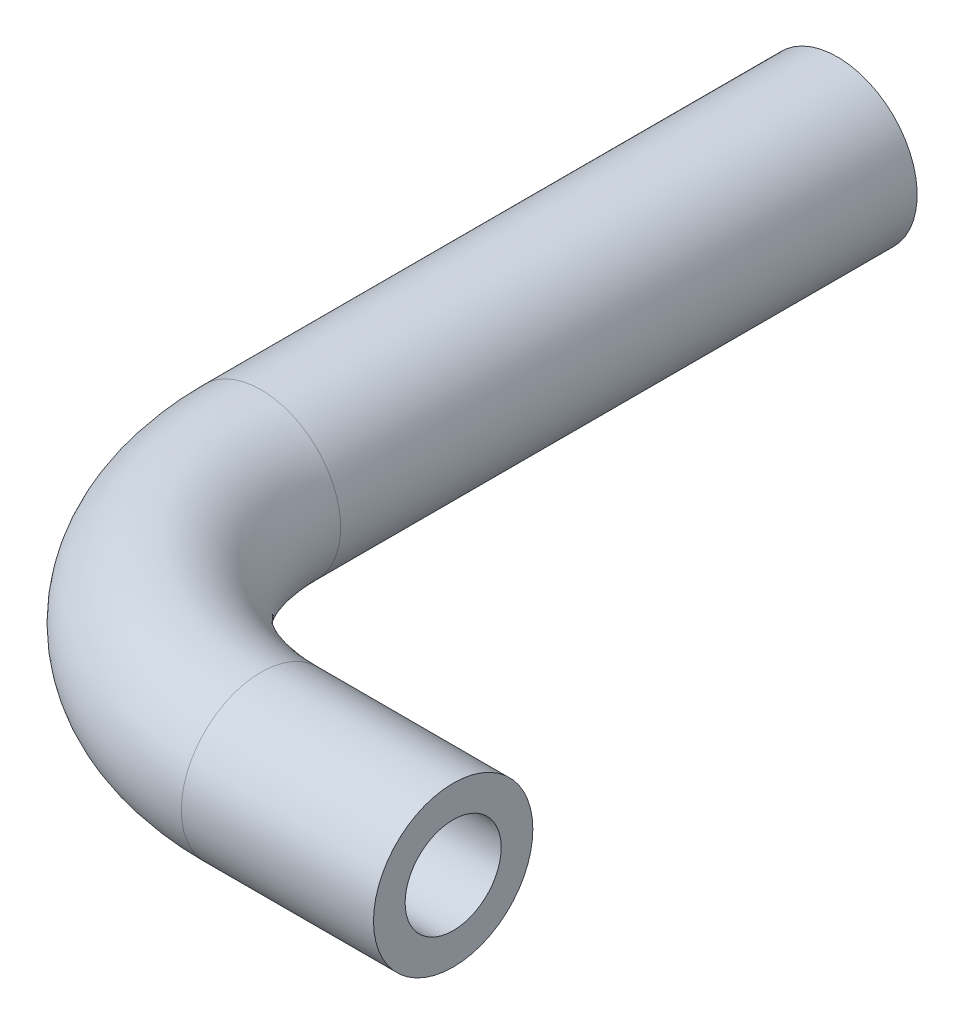
ISO-10303-21;
HEADER;
FILE_DESCRIPTION(('STEP AP214'),'2;1');
FILE_NAME('part.step','',(''),(''),'','','');
FILE_SCHEMA(('AUTOMOTIVE_DESIGN { 1 0 10303 214 1 1 1 1 }'));
ENDSEC;
DATA;
#1=APPLICATION_CONTEXT('core data for automotive mechanical design processes');
#2=APPLICATION_PROTOCOL_DEFINITION('international standard','automotive_design',2000,#1);
#3=PRODUCT_CONTEXT('',#1,'mechanical');
#4=PRODUCT('Part','Part','',(#3));
#5=PRODUCT_RELATED_PRODUCT_CATEGORY('part','',(#4));
#6=PRODUCT_DEFINITION_FORMATION('','',#4);
#7=PRODUCT_DEFINITION_CONTEXT('part definition',#1,'design');
#8=PRODUCT_DEFINITION('design','',#6,#7);
#9=PRODUCT_DEFINITION_SHAPE('','',#8);
#10=(LENGTH_UNIT() NAMED_UNIT(*) SI_UNIT(.MILLI.,.METRE.));
#11=(NAMED_UNIT(*) PLANE_ANGLE_UNIT() SI_UNIT($,.RADIAN.));
#12=(NAMED_UNIT(*) SI_UNIT($,.STERADIAN.) SOLID_ANGLE_UNIT());
#13=UNCERTAINTY_MEASURE_WITH_UNIT(LENGTH_MEASURE(1.E-05),#10,'distance_accuracy_value','');
#14=(GEOMETRIC_REPRESENTATION_CONTEXT(3) GLOBAL_UNCERTAINTY_ASSIGNED_CONTEXT((#13)) GLOBAL_UNIT_ASSIGNED_CONTEXT((#10,
#11,#12)) REPRESENTATION_CONTEXT('',''));
#15=CARTESIAN_POINT('',(0.,0.,0.));
#16=DIRECTION('',(0.,0.,1.));
#17=DIRECTION('',(1.,0.,0.));
#18=AXIS2_PLACEMENT_3D('',#15,#16,#17);
#19=CARTESIAN_POINT('',(0.,0.,-32.3402844362731));
#20=DIRECTION('',(0.,-1.,0.));
#21=DIRECTION('',(0.,0.,-1.));
#22=AXIS2_PLACEMENT_3D('',#19,#20,#21);
#23=TOROIDAL_SURFACE('',#22,32.3402844362731,10.5308858365806);
#24=CARTESIAN_POINT('',(0.,0.,0.));
#25=DIRECTION('',(1.,0.,0.));
#26=DIRECTION('',(0.,0.,-1.));
#27=AXIS2_PLACEMENT_3D('',#24,#25,#26);
#28=CIRCLE('',#27,10.5308858365806);
#29=CARTESIAN_POINT('',(0.,0.,10.5308858365806));
#30=VERTEX_POINT('',#29);
#31=EDGE_CURVE('E40',#30,#30,#28,.T.);
#32=CARTESIAN_POINT('',(-32.3402844362731,0.,-32.3402844362731));
#33=DIRECTION('',(0.,0.,-1.));
#34=DIRECTION('',(-1.,0.,0.));
#35=AXIS2_PLACEMENT_3D('',#32,#33,#34);
#36=CIRCLE('',#35,10.5308858365806);
#37=CARTESIAN_POINT('',(-42.8711702728538,0.,-32.3402844362731));
#38=VERTEX_POINT('',#37);
#39=EDGE_CURVE('E51',#38,#38,#36,.T.);
#40=CARTESIAN_POINT('',(0.,0.,-32.3402844362731));
#41=DIRECTION('',(0.,-1.,0.));
#42=DIRECTION('',(0.,0.,-1.));
#43=AXIS2_PLACEMENT_3D('',#40,#41,#42);
#44=CIRCLE('',#43,42.8711702728538);
#45=EDGE_CURVE('',#30,#38,#44,.T.);
#46=ORIENTED_EDGE('',*,*,#31,.F.);
#47=ORIENTED_EDGE('',*,*,#39,.F.);
#48=ORIENTED_EDGE('',*,*,#45,.T.);
#49=ORIENTED_EDGE('',*,*,#45,.F.);
#50=EDGE_LOOP('',(#46,#48,#47,#49));
#51=FACE_BOUND('',#50,.T.);
#52=ADVANCED_FACE('F37',(#51),#23,.T.);
#53=CARTESIAN_POINT('',(0.,0.,-32.3402844362731));
#54=DIRECTION('',(0.,-1.,0.));
#55=DIRECTION('',(0.,0.,-1.));
#56=AXIS2_PLACEMENT_3D('',#53,#54,#55);
#57=TOROIDAL_SURFACE('',#56,32.3402844362731,6.35);
#58=CARTESIAN_POINT('',(0.,0.,0.));
#59=DIRECTION('',(1.,0.,0.));
#60=DIRECTION('',(0.,0.,-1.));
#61=AXIS2_PLACEMENT_3D('',#58,#59,#60);
#62=CIRCLE('',#61,6.35);
#63=CARTESIAN_POINT('',(0.,0.,6.35));
#64=VERTEX_POINT('',#63);
#65=EDGE_CURVE('E10',#64,#64,#62,.F.);
#66=CARTESIAN_POINT('',(-32.3402844362731,0.,-32.3402844362731));
#67=DIRECTION('',(0.,0.,-1.));
#68=DIRECTION('',(-1.,0.,0.));
#69=AXIS2_PLACEMENT_3D('',#66,#67,#68);
#70=CIRCLE('',#69,6.35);
#71=CARTESIAN_POINT('',(-38.6902844362731,0.,-32.3402844362731));
#72=VERTEX_POINT('',#71);
#73=EDGE_CURVE('E59',#72,#72,#70,.T.);
#74=CARTESIAN_POINT('',(0.,0.,-32.3402844362731));
#75=DIRECTION('',(0.,-1.,0.));
#76=DIRECTION('',(0.,0.,-1.));
#77=AXIS2_PLACEMENT_3D('',#74,#75,#76);
#78=CIRCLE('',#77,38.6902844362731);
#79=EDGE_CURVE('',#64,#72,#78,.T.);
#80=ORIENTED_EDGE('',*,*,#65,.F.);
#81=ORIENTED_EDGE('',*,*,#73,.T.);
#82=ORIENTED_EDGE('',*,*,#79,.T.);
#83=ORIENTED_EDGE('',*,*,#79,.F.);
#84=EDGE_LOOP('',(#80,#82,#81,#83));
#85=FACE_BOUND('',#84,.T.);
#86=ADVANCED_FACE('F93',(#85),#57,.F.);
#87=CARTESIAN_POINT('',(-32.3402844362731,0.,-108.540284436273));
#88=DIRECTION('',(0.,0.,-1.));
#89=DIRECTION('',(-1.,0.,0.));
#90=AXIS2_PLACEMENT_3D('',#87,#88,#89);
#91=PLANE('',#90);
#92=CARTESIAN_POINT('',(-32.3402844362731,0.,-108.540284436273));
#93=DIRECTION('',(0.,0.,-1.));
#94=DIRECTION('',(-1.,0.,0.));
#95=AXIS2_PLACEMENT_3D('',#92,#93,#94);
#96=CIRCLE('',#95,10.5308858365806);
#97=CARTESIAN_POINT('',(-42.8711702728538,0.,-108.540284436273));
#98=VERTEX_POINT('',#97);
#99=EDGE_CURVE('E49',#98,#98,#96,.T.);
#100=ORIENTED_EDGE('',*,*,#99,.T.);
#101=EDGE_LOOP('',(#100));
#102=FACE_BOUND('',#101,.T.);
#103=CARTESIAN_POINT('',(-32.3402844362731,0.,-108.540284436273));
#104=DIRECTION('',(0.,0.,-1.));
#105=DIRECTION('',(-1.,0.,0.));
#106=AXIS2_PLACEMENT_3D('',#103,#104,#105);
#107=CIRCLE('',#106,6.35);
#108=CARTESIAN_POINT('',(-38.6902844362731,0.,-108.540284436273));
#109=VERTEX_POINT('',#108);
#110=EDGE_CURVE('E55',#109,#109,#107,.T.);
#111=ORIENTED_EDGE('',*,*,#110,.F.);
#112=EDGE_LOOP('',(#111));
#113=FACE_BOUND('',#112,.T.);
#114=ADVANCED_FACE('F95',(#102,#113),#91,.T.);
#115=CARTESIAN_POINT('',(-32.3402844362731,0.,-108.540284436273));
#116=DIRECTION('',(0.,0.,1.));
#117=DIRECTION('',(1.,0.,0.));
#118=AXIS2_PLACEMENT_3D('',#115,#116,#117);
#119=CYLINDRICAL_SURFACE('',#118,10.5308858365806);
#120=ORIENTED_EDGE('',*,*,#99,.F.);
#121=EDGE_LOOP('',(#120));
#122=FACE_BOUND('',#121,.T.);
#123=ORIENTED_EDGE('',*,*,#39,.T.);
#124=EDGE_LOOP('',(#123));
#125=FACE_BOUND('',#124,.T.);
#126=ADVANCED_FACE('F89',(#122,#125),#119,.T.);
#127=CARTESIAN_POINT('',(-32.3402844362731,0.,-108.540284436273));
#128=DIRECTION('',(0.,0.,1.));
#129=DIRECTION('',(1.,0.,0.));
#130=AXIS2_PLACEMENT_3D('',#127,#128,#129);
#131=CYLINDRICAL_SURFACE('',#130,6.35);
#132=ORIENTED_EDGE('',*,*,#110,.T.);
#133=EDGE_LOOP('',(#132));
#134=FACE_BOUND('',#133,.T.);
#135=ORIENTED_EDGE('',*,*,#73,.F.);
#136=EDGE_LOOP('',(#135));
#137=FACE_BOUND('',#136,.T.);
#138=ADVANCED_FACE('F80',(#134,#137),#131,.F.);
#139=CARTESIAN_POINT('',(25.4,0.,0.));
#140=DIRECTION('',(1.,0.,0.));
#141=DIRECTION('',(0.,0.,-1.));
#142=AXIS2_PLACEMENT_3D('',#139,#140,#141);
#143=PLANE('',#142);
#144=CARTESIAN_POINT('',(25.4,0.,0.));
#145=DIRECTION('',(1.,0.,0.));
#146=DIRECTION('',(0.,0.,-1.));
#147=AXIS2_PLACEMENT_3D('',#144,#145,#146);
#148=CIRCLE('',#147,10.5308858365806);
#149=CARTESIAN_POINT('',(25.4,0.,-10.5308858365806));
#150=VERTEX_POINT('',#149);
#151=EDGE_CURVE('E63',#150,#150,#148,.T.);
#152=ORIENTED_EDGE('',*,*,#151,.T.);
#153=EDGE_LOOP('',(#152));
#154=FACE_BOUND('',#153,.T.);
#155=CARTESIAN_POINT('',(25.4,0.,0.));
#156=DIRECTION('',(1.,0.,0.));
#157=DIRECTION('',(0.,0.,-1.));
#158=AXIS2_PLACEMENT_3D('',#155,#156,#157);
#159=CIRCLE('',#158,6.35);
#160=CARTESIAN_POINT('',(25.4,0.,-6.35));
#161=VERTEX_POINT('',#160);
#162=EDGE_CURVE('E70',#161,#161,#159,.T.);
#163=ORIENTED_EDGE('',*,*,#162,.F.);
#164=EDGE_LOOP('',(#163));
#165=FACE_BOUND('',#164,.T.);
#166=ADVANCED_FACE('F77',(#154,#165),#143,.T.);
#167=CARTESIAN_POINT('',(25.4,0.,0.));
#168=DIRECTION('',(-1.,0.,0.));
#169=DIRECTION('',(0.,0.,1.));
#170=AXIS2_PLACEMENT_3D('',#167,#168,#169);
#171=CYLINDRICAL_SURFACE('',#170,10.5308858365806);
#172=ORIENTED_EDGE('',*,*,#151,.F.);
#173=EDGE_LOOP('',(#172));
#174=FACE_BOUND('',#173,.T.);
#175=ORIENTED_EDGE('',*,*,#31,.T.);
#176=EDGE_LOOP('',(#175));
#177=FACE_BOUND('',#176,.T.);
#178=ADVANCED_FACE('F79',(#174,#177),#171,.T.);
#179=CARTESIAN_POINT('',(25.4,0.,0.));
#180=DIRECTION('',(-1.,0.,0.));
#181=DIRECTION('',(0.,0.,1.));
#182=AXIS2_PLACEMENT_3D('',#179,#180,#181);
#183=CYLINDRICAL_SURFACE('',#182,6.35);
#184=ORIENTED_EDGE('',*,*,#162,.T.);
#185=EDGE_LOOP('',(#184));
#186=FACE_BOUND('',#185,.T.);
#187=ORIENTED_EDGE('',*,*,#65,.T.);
#188=EDGE_LOOP('',(#187));
#189=FACE_BOUND('',#188,.T.);
#190=ADVANCED_FACE('F75',(#186,#189),#183,.F.);
#191=CLOSED_SHELL('',(#52,#86,#114,#126,#138,#166,#178,#190));
#192=MANIFOLD_SOLID_BREP('B2',#191);
#193=ADVANCED_BREP_SHAPE_REPRESENTATION('',(#18,#192),#14);
#194=SHAPE_DEFINITION_REPRESENTATION(#9,#193);
ENDSEC;
END-ISO-10303-21;
